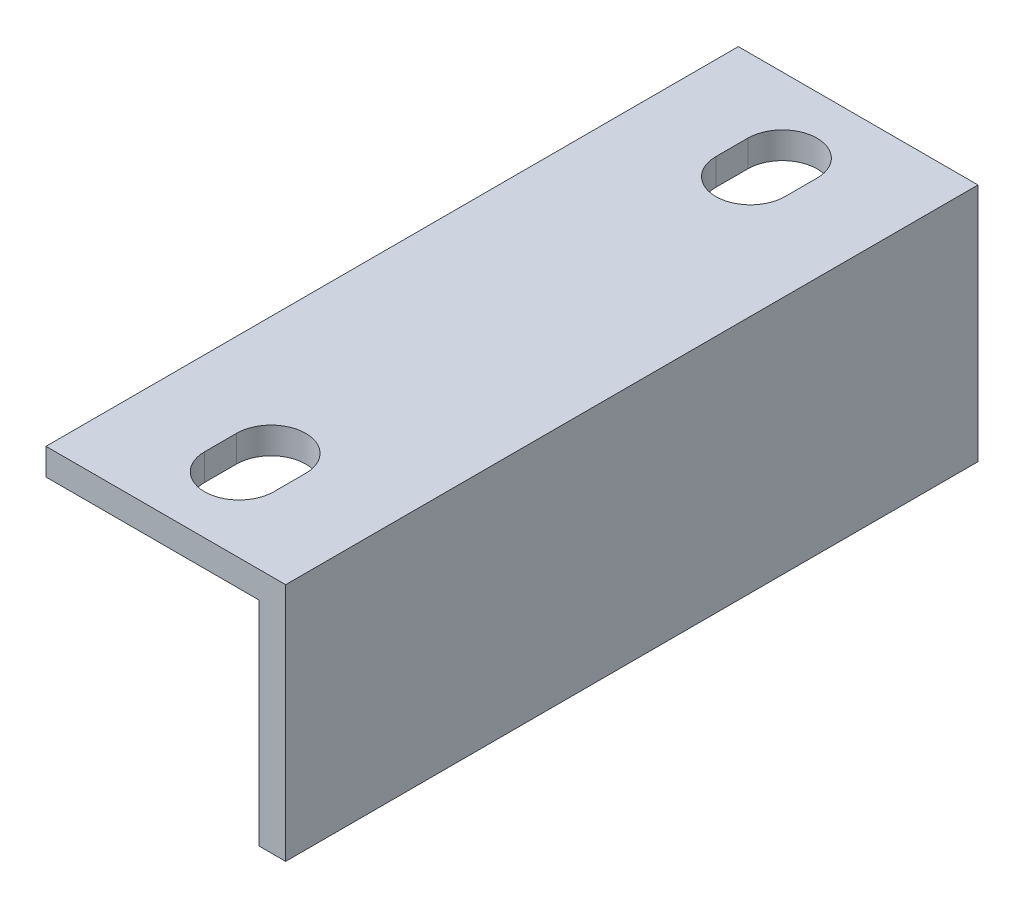
ISO-10303-21;
HEADER;
FILE_DESCRIPTION(('STEP AP214'),'2;1');
FILE_NAME('part.step','',(''),(''),'','','');
FILE_SCHEMA(('AUTOMOTIVE_DESIGN { 1 0 10303 214 1 1 1 1 }'));
ENDSEC;
DATA;
#1=APPLICATION_CONTEXT('core data for automotive mechanical design processes');
#2=APPLICATION_PROTOCOL_DEFINITION('international standard','automotive_design',2000,#1);
#3=PRODUCT_CONTEXT('',#1,'mechanical');
#4=PRODUCT('Part','Part','',(#3));
#5=PRODUCT_RELATED_PRODUCT_CATEGORY('part','',(#4));
#6=PRODUCT_DEFINITION_FORMATION('','',#4);
#7=PRODUCT_DEFINITION_CONTEXT('part definition',#1,'design');
#8=PRODUCT_DEFINITION('design','',#6,#7);
#9=PRODUCT_DEFINITION_SHAPE('','',#8);
#10=(LENGTH_UNIT() NAMED_UNIT(*) SI_UNIT(.MILLI.,.METRE.));
#11=(NAMED_UNIT(*) PLANE_ANGLE_UNIT() SI_UNIT($,.RADIAN.));
#12=(NAMED_UNIT(*) SI_UNIT($,.STERADIAN.) SOLID_ANGLE_UNIT());
#13=UNCERTAINTY_MEASURE_WITH_UNIT(LENGTH_MEASURE(1.E-05),#10,'distance_accuracy_value','');
#14=(GEOMETRIC_REPRESENTATION_CONTEXT(3) GLOBAL_UNCERTAINTY_ASSIGNED_CONTEXT((#13)) GLOBAL_UNIT_ASSIGNED_CONTEXT((#10,
#11,#12)) REPRESENTATION_CONTEXT('',''));
#15=CARTESIAN_POINT('',(0.,0.,0.));
#16=DIRECTION('',(0.,0.,1.));
#17=DIRECTION('',(1.,0.,0.));
#18=AXIS2_PLACEMENT_3D('',#15,#16,#17);
#19=CARTESIAN_POINT('',(0.,0.,130.));
#20=DIRECTION('',(1.,0.,0.));
#21=DIRECTION('',(0.,0.,-1.));
#22=AXIS2_PLACEMENT_3D('',#19,#20,#21);
#23=PLANE('',#22);
#24=DIRECTION('',(0.,-1.,0.));
#25=VECTOR('',#24,1.);
#26=CARTESIAN_POINT('',(0.,0.,0.));
#27=LINE('',#26,#25);
#28=CARTESIAN_POINT('',(0.,5.,0.));
#29=VERTEX_POINT('',#28);
#30=CARTESIAN_POINT('',(0.,0.,0.));
#31=VERTEX_POINT('',#30);
#32=EDGE_CURVE('E239',#29,#31,#27,.T.);
#33=ORIENTED_EDGE('',*,*,#32,.T.);
#34=DIRECTION('',(0.,0.,-1.));
#35=VECTOR('',#34,1.);
#36=CARTESIAN_POINT('',(0.,0.,130.));
#37=LINE('',#36,#35);
#38=CARTESIAN_POINT('',(0.,0.,130.));
#39=VERTEX_POINT('',#38);
#40=EDGE_CURVE('E11',#39,#31,#37,.T.);
#41=ORIENTED_EDGE('',*,*,#40,.F.);
#42=DIRECTION('',(0.,-1.,0.));
#43=VECTOR('',#42,1.);
#44=CARTESIAN_POINT('',(0.,0.,130.));
#45=LINE('',#44,#43);
#46=CARTESIAN_POINT('',(0.,5.,130.));
#47=VERTEX_POINT('',#46);
#48=EDGE_CURVE('E240',#47,#39,#45,.T.);
#49=ORIENTED_EDGE('',*,*,#48,.F.);
#50=DIRECTION('',(0.,0.,-1.));
#51=VECTOR('',#50,1.);
#52=CARTESIAN_POINT('',(0.,5.,130.));
#53=LINE('',#52,#51);
#54=EDGE_CURVE('E260',#47,#29,#53,.T.);
#55=ORIENTED_EDGE('',*,*,#54,.T.);
#56=EDGE_LOOP('',(#33,#41,#49,#55));
#57=FACE_BOUND('',#56,.T.);
#58=ADVANCED_FACE('F45',(#57),#23,.F.);
#59=CARTESIAN_POINT('',(0.,0.,130.));
#60=DIRECTION('',(0.,1.,0.));
#61=DIRECTION('',(0.,0.,1.));
#62=AXIS2_PLACEMENT_3D('',#59,#60,#61);
#63=PLANE('',#62);
#64=DIRECTION('',(0.,0.,-1.));
#65=VECTOR('',#64,1.);
#66=CARTESIAN_POINT('',(28.7730827990603,0.,130.));
#67=LINE('',#66,#65);
#68=CARTESIAN_POINT('',(28.7730827990603,0.,20.));
#69=VERTEX_POINT('',#68);
#70=CARTESIAN_POINT('',(28.7730827990603,0.,14.));
#71=VERTEX_POINT('',#70);
#72=EDGE_CURVE('E231',#69,#71,#67,.T.);
#73=ORIENTED_EDGE('',*,*,#72,.T.);
#74=CARTESIAN_POINT('',(22.2730827990603,0.,14.));
#75=DIRECTION('',(0.,1.,0.));
#76=DIRECTION('',(0.,0.,1.));
#77=AXIS2_PLACEMENT_3D('',#74,#75,#76);
#78=CIRCLE('',#77,6.49999999999998);
#79=CARTESIAN_POINT('',(15.7730827990603,0.,14.));
#80=VERTEX_POINT('',#79);
#81=EDGE_CURVE('E235',#71,#80,#78,.T.);
#82=ORIENTED_EDGE('',*,*,#81,.T.);
#83=DIRECTION('',(0.,0.,1.));
#84=VECTOR('',#83,1.);
#85=CARTESIAN_POINT('',(15.7730827990603,0.,130.));
#86=LINE('',#85,#84);
#87=CARTESIAN_POINT('',(15.7730827990603,0.,20.));
#88=VERTEX_POINT('',#87);
#89=EDGE_CURVE('E226',#80,#88,#86,.T.);
#90=ORIENTED_EDGE('',*,*,#89,.T.);
#91=CARTESIAN_POINT('',(22.2730827990603,0.,20.));
#92=DIRECTION('',(0.,1.,0.));
#93=DIRECTION('',(0.,0.,1.));
#94=AXIS2_PLACEMENT_3D('',#91,#92,#93);
#95=CIRCLE('',#94,6.49999999999998);
#96=EDGE_CURVE('E151',#88,#69,#95,.T.);
#97=ORIENTED_EDGE('',*,*,#96,.T.);
#98=EDGE_LOOP('',(#73,#82,#90,#97));
#99=FACE_BOUND('',#98,.T.);
#100=DIRECTION('',(0.,0.,1.));
#101=VECTOR('',#100,1.);
#102=CARTESIAN_POINT('',(15.7730827990603,0.,130.));
#103=LINE('',#102,#101);
#104=CARTESIAN_POINT('',(15.7730827990603,0.,110.));
#105=VERTEX_POINT('',#104);
#106=CARTESIAN_POINT('',(15.7730827990603,0.,116.));
#107=VERTEX_POINT('',#106);
#108=EDGE_CURVE('E218',#105,#107,#103,.T.);
#109=ORIENTED_EDGE('',*,*,#108,.T.);
#110=CARTESIAN_POINT('',(22.2730827990603,0.,116.));
#111=DIRECTION('',(0.,1.,0.));
#112=DIRECTION('',(0.,0.,1.));
#113=AXIS2_PLACEMENT_3D('',#110,#111,#112);
#114=CIRCLE('',#113,6.49999999999998);
#115=CARTESIAN_POINT('',(28.7730827990603,0.,116.));
#116=VERTEX_POINT('',#115);
#117=EDGE_CURVE('E222',#107,#116,#114,.T.);
#118=ORIENTED_EDGE('',*,*,#117,.T.);
#119=DIRECTION('',(0.,0.,-1.));
#120=VECTOR('',#119,1.);
#121=CARTESIAN_POINT('',(28.7730827990603,0.,130.));
#122=LINE('',#121,#120);
#123=CARTESIAN_POINT('',(28.7730827990603,0.,110.));
#124=VERTEX_POINT('',#123);
#125=EDGE_CURVE('E180',#116,#124,#122,.T.);
#126=ORIENTED_EDGE('',*,*,#125,.T.);
#127=CARTESIAN_POINT('',(22.2730827990603,0.,110.));
#128=DIRECTION('',(0.,1.,0.));
#129=DIRECTION('',(0.,0.,1.));
#130=AXIS2_PLACEMENT_3D('',#127,#128,#129);
#131=CIRCLE('',#130,6.49999999999998);
#132=EDGE_CURVE('E214',#124,#105,#131,.T.);
#133=ORIENTED_EDGE('',*,*,#132,.T.);
#134=EDGE_LOOP('',(#109,#118,#126,#133));
#135=FACE_BOUND('',#134,.T.);
#136=DIRECTION('',(1.,0.,0.));
#137=VECTOR('',#136,1.);
#138=CARTESIAN_POINT('',(0.,0.,0.));
#139=LINE('',#138,#137);
#140=CARTESIAN_POINT('',(40.,0.,0.));
#141=VERTEX_POINT('',#140);
#142=EDGE_CURVE('E264',#31,#141,#139,.T.);
#143=ORIENTED_EDGE('',*,*,#142,.T.);
#144=DIRECTION('',(0.,0.,-1.));
#145=VECTOR('',#144,1.);
#146=CARTESIAN_POINT('',(40.,0.,130.));
#147=LINE('',#146,#145);
#148=CARTESIAN_POINT('',(40.,0.,130.));
#149=VERTEX_POINT('',#148);
#150=EDGE_CURVE('E53',#149,#141,#147,.T.);
#151=ORIENTED_EDGE('',*,*,#150,.F.);
#152=DIRECTION('',(1.,0.,0.));
#153=VECTOR('',#152,1.);
#154=CARTESIAN_POINT('',(0.,0.,130.));
#155=LINE('',#154,#153);
#156=EDGE_CURVE('E244',#39,#149,#155,.T.);
#157=ORIENTED_EDGE('',*,*,#156,.F.);
#158=ORIENTED_EDGE('',*,*,#40,.T.);
#159=EDGE_LOOP('',(#143,#151,#157,#158));
#160=FACE_BOUND('',#159,.T.);
#161=ADVANCED_FACE('F321',(#99,#135,#160),#63,.F.);
#162=CARTESIAN_POINT('',(40.,0.,130.));
#163=DIRECTION('',(1.,0.,0.));
#164=DIRECTION('',(0.,0.,-1.));
#165=AXIS2_PLACEMENT_3D('',#162,#163,#164);
#166=PLANE('',#165);
#167=DIRECTION('',(0.,-1.,0.));
#168=VECTOR('',#167,1.);
#169=CARTESIAN_POINT('',(40.,0.,0.));
#170=LINE('',#169,#168);
#171=CARTESIAN_POINT('',(40.,-40.,0.));
#172=VERTEX_POINT('',#171);
#173=EDGE_CURVE('E267',#141,#172,#170,.T.);
#174=ORIENTED_EDGE('',*,*,#173,.T.);
#175=DIRECTION('',(0.,0.,-1.));
#176=VECTOR('',#175,1.);
#177=CARTESIAN_POINT('',(40.,-40.,130.));
#178=LINE('',#177,#176);
#179=CARTESIAN_POINT('',(40.,-40.,130.));
#180=VERTEX_POINT('',#179);
#181=EDGE_CURVE('E289',#180,#172,#178,.T.);
#182=ORIENTED_EDGE('',*,*,#181,.F.);
#183=DIRECTION('',(0.,-1.,0.));
#184=VECTOR('',#183,1.);
#185=CARTESIAN_POINT('',(40.,0.,130.));
#186=LINE('',#185,#184);
#187=EDGE_CURVE('E248',#149,#180,#186,.T.);
#188=ORIENTED_EDGE('',*,*,#187,.F.);
#189=ORIENTED_EDGE('',*,*,#150,.T.);
#190=EDGE_LOOP('',(#174,#182,#188,#189));
#191=FACE_BOUND('',#190,.T.);
#192=ADVANCED_FACE('F298',(#191),#166,.F.);
#193=CARTESIAN_POINT('',(40.,-40.,130.));
#194=DIRECTION('',(0.,1.,0.));
#195=DIRECTION('',(0.,0.,1.));
#196=AXIS2_PLACEMENT_3D('',#193,#194,#195);
#197=PLANE('',#196);
#198=DIRECTION('',(1.,0.,0.));
#199=VECTOR('',#198,1.);
#200=CARTESIAN_POINT('',(40.,-40.,0.));
#201=LINE('',#200,#199);
#202=CARTESIAN_POINT('',(45.,-40.,0.));
#203=VERTEX_POINT('',#202);
#204=EDGE_CURVE('E270',#172,#203,#201,.T.);
#205=ORIENTED_EDGE('',*,*,#204,.T.);
#206=DIRECTION('',(0.,0.,-1.));
#207=VECTOR('',#206,1.);
#208=CARTESIAN_POINT('',(45.,-40.,130.));
#209=LINE('',#208,#207);
#210=CARTESIAN_POINT('',(45.,-40.,130.));
#211=VERTEX_POINT('',#210);
#212=EDGE_CURVE('E285',#211,#203,#209,.T.);
#213=ORIENTED_EDGE('',*,*,#212,.F.);
#214=DIRECTION('',(1.,0.,0.));
#215=VECTOR('',#214,1.);
#216=CARTESIAN_POINT('',(40.,-40.,130.));
#217=LINE('',#216,#215);
#218=EDGE_CURVE('E251',#180,#211,#217,.T.);
#219=ORIENTED_EDGE('',*,*,#218,.F.);
#220=ORIENTED_EDGE('',*,*,#181,.T.);
#221=EDGE_LOOP('',(#205,#213,#219,#220));
#222=FACE_BOUND('',#221,.T.);
#223=ADVANCED_FACE('F309',(#222),#197,.F.);
#224=CARTESIAN_POINT('',(45.,5.,130.));
#225=DIRECTION('',(-1.,0.,0.));
#226=DIRECTION('',(0.,-1.,0.));
#227=AXIS2_PLACEMENT_3D('',#224,#225,#226);
#228=PLANE('',#227);
#229=DIRECTION('',(0.,1.,0.));
#230=VECTOR('',#229,1.);
#231=CARTESIAN_POINT('',(45.,5.,0.));
#232=LINE('',#231,#230);
#233=CARTESIAN_POINT('',(45.,5.,0.));
#234=VERTEX_POINT('',#233);
#235=EDGE_CURVE('E273',#203,#234,#232,.T.);
#236=ORIENTED_EDGE('',*,*,#235,.T.);
#237=DIRECTION('',(0.,0.,-1.));
#238=VECTOR('',#237,1.);
#239=CARTESIAN_POINT('',(45.,5.,130.));
#240=LINE('',#239,#238);
#241=CARTESIAN_POINT('',(45.,5.,130.));
#242=VERTEX_POINT('',#241);
#243=EDGE_CURVE('E281',#242,#234,#240,.T.);
#244=ORIENTED_EDGE('',*,*,#243,.F.);
#245=DIRECTION('',(0.,1.,0.));
#246=VECTOR('',#245,1.);
#247=CARTESIAN_POINT('',(45.,5.,130.));
#248=LINE('',#247,#246);
#249=EDGE_CURVE('E254',#211,#242,#248,.T.);
#250=ORIENTED_EDGE('',*,*,#249,.F.);
#251=ORIENTED_EDGE('',*,*,#212,.T.);
#252=EDGE_LOOP('',(#236,#244,#250,#251));
#253=FACE_BOUND('',#252,.T.);
#254=ADVANCED_FACE('F313',(#253),#228,.F.);
#255=CARTESIAN_POINT('',(0.,5.,130.));
#256=DIRECTION('',(0.,-1.,0.));
#257=DIRECTION('',(0.,0.,-1.));
#258=AXIS2_PLACEMENT_3D('',#255,#256,#257);
#259=PLANE('',#258);
#260=DIRECTION('',(0.,0.,1.));
#261=VECTOR('',#260,1.);
#262=CARTESIAN_POINT('',(15.7730827990603,5.,14.));
#263=LINE('',#262,#261);
#264=CARTESIAN_POINT('',(15.7730827990603,5.,14.));
#265=VERTEX_POINT('',#264);
#266=CARTESIAN_POINT('',(15.7730827990603,5.,20.));
#267=VERTEX_POINT('',#266);
#268=EDGE_CURVE('E159',#265,#267,#263,.T.);
#269=ORIENTED_EDGE('',*,*,#268,.F.);
#270=CARTESIAN_POINT('',(22.2730827990603,5.,14.));
#271=DIRECTION('',(0.,1.,0.));
#272=DIRECTION('',(0.,0.,1.));
#273=AXIS2_PLACEMENT_3D('',#270,#271,#272);
#274=CIRCLE('',#273,6.49999999999998);
#275=CARTESIAN_POINT('',(28.7730827990603,5.,14.));
#276=VERTEX_POINT('',#275);
#277=EDGE_CURVE('E165',#276,#265,#274,.T.);
#278=ORIENTED_EDGE('',*,*,#277,.F.);
#279=DIRECTION('',(0.,0.,-1.));
#280=VECTOR('',#279,1.);
#281=CARTESIAN_POINT('',(28.7730827990603,5.,14.));
#282=LINE('',#281,#280);
#283=CARTESIAN_POINT('',(28.7730827990603,5.,20.));
#284=VERTEX_POINT('',#283);
#285=EDGE_CURVE('E170',#284,#276,#282,.T.);
#286=ORIENTED_EDGE('',*,*,#285,.F.);
#287=CARTESIAN_POINT('',(22.2730827990603,5.,20.));
#288=DIRECTION('',(0.,1.,0.));
#289=DIRECTION('',(0.,0.,1.));
#290=AXIS2_PLACEMENT_3D('',#287,#288,#289);
#291=CIRCLE('',#290,6.49999999999998);
#292=EDGE_CURVE('E148',#267,#284,#291,.T.);
#293=ORIENTED_EDGE('',*,*,#292,.F.);
#294=EDGE_LOOP('',(#269,#278,#286,#293));
#295=FACE_BOUND('',#294,.T.);
#296=DIRECTION('',(0.,0.,-1.));
#297=VECTOR('',#296,1.);
#298=CARTESIAN_POINT('',(28.7730827990603,5.,116.));
#299=LINE('',#298,#297);
#300=CARTESIAN_POINT('',(28.7730827990603,5.,116.));
#301=VERTEX_POINT('',#300);
#302=CARTESIAN_POINT('',(28.7730827990603,5.,110.));
#303=VERTEX_POINT('',#302);
#304=EDGE_CURVE('E205',#301,#303,#299,.T.);
#305=ORIENTED_EDGE('',*,*,#304,.F.);
#306=CARTESIAN_POINT('',(22.2730827990603,5.,116.));
#307=DIRECTION('',(0.,1.,0.));
#308=DIRECTION('',(0.,0.,-1.));
#309=AXIS2_PLACEMENT_3D('',#306,#307,#308);
#310=CIRCLE('',#309,6.49999999999998);
#311=CARTESIAN_POINT('',(15.7730827990603,5.,116.));
#312=VERTEX_POINT('',#311);
#313=EDGE_CURVE('E208',#312,#301,#310,.T.);
#314=ORIENTED_EDGE('',*,*,#313,.F.);
#315=DIRECTION('',(0.,0.,1.));
#316=VECTOR('',#315,1.);
#317=CARTESIAN_POINT('',(15.7730827990603,5.,116.));
#318=LINE('',#317,#316);
#319=CARTESIAN_POINT('',(15.7730827990603,5.,110.));
#320=VERTEX_POINT('',#319);
#321=EDGE_CURVE('E189',#320,#312,#318,.T.);
#322=ORIENTED_EDGE('',*,*,#321,.F.);
#323=CARTESIAN_POINT('',(22.2730827990603,5.,110.));
#324=DIRECTION('',(0.,1.,0.));
#325=DIRECTION('',(0.,0.,-1.));
#326=AXIS2_PLACEMENT_3D('',#323,#324,#325);
#327=CIRCLE('',#326,6.49999999999998);
#328=EDGE_CURVE('E201',#303,#320,#327,.T.);
#329=ORIENTED_EDGE('',*,*,#328,.F.);
#330=EDGE_LOOP('',(#305,#314,#322,#329));
#331=FACE_BOUND('',#330,.T.);
#332=DIRECTION('',(-1.,0.,0.));
#333=VECTOR('',#332,1.);
#334=CARTESIAN_POINT('',(0.,5.,0.));
#335=LINE('',#334,#333);
#336=EDGE_CURVE('E245',#234,#29,#335,.T.);
#337=ORIENTED_EDGE('',*,*,#336,.T.);
#338=ORIENTED_EDGE('',*,*,#54,.F.);
#339=DIRECTION('',(-1.,0.,0.));
#340=VECTOR('',#339,1.);
#341=CARTESIAN_POINT('',(0.,5.,130.));
#342=LINE('',#341,#340);
#343=EDGE_CURVE('E257',#242,#47,#342,.T.);
#344=ORIENTED_EDGE('',*,*,#343,.F.);
#345=ORIENTED_EDGE('',*,*,#243,.T.);
#346=EDGE_LOOP('',(#337,#338,#344,#345));
#347=FACE_BOUND('',#346,.T.);
#348=ADVANCED_FACE('F167',(#295,#331,#347),#259,.F.);
#349=CARTESIAN_POINT('',(0.,0.,130.));
#350=DIRECTION('',(0.,0.,-1.));
#351=DIRECTION('',(-1.,0.,0.));
#352=AXIS2_PLACEMENT_3D('',#349,#350,#351);
#353=PLANE('',#352);
#354=ORIENTED_EDGE('',*,*,#48,.T.);
#355=ORIENTED_EDGE('',*,*,#156,.T.);
#356=ORIENTED_EDGE('',*,*,#187,.T.);
#357=ORIENTED_EDGE('',*,*,#218,.T.);
#358=ORIENTED_EDGE('',*,*,#249,.T.);
#359=ORIENTED_EDGE('',*,*,#343,.T.);
#360=EDGE_LOOP('',(#354,#355,#356,#357,#358,#359));
#361=FACE_BOUND('',#360,.T.);
#362=ADVANCED_FACE('F317',(#361),#353,.F.);
#363=CARTESIAN_POINT('',(0.,0.,0.));
#364=DIRECTION('',(0.,0.,-1.));
#365=DIRECTION('',(-1.,0.,0.));
#366=AXIS2_PLACEMENT_3D('',#363,#364,#365);
#367=PLANE('',#366);
#368=ORIENTED_EDGE('',*,*,#32,.F.);
#369=ORIENTED_EDGE('',*,*,#336,.F.);
#370=ORIENTED_EDGE('',*,*,#235,.F.);
#371=ORIENTED_EDGE('',*,*,#204,.F.);
#372=ORIENTED_EDGE('',*,*,#173,.F.);
#373=ORIENTED_EDGE('',*,*,#142,.F.);
#374=EDGE_LOOP('',(#368,#369,#370,#371,#372,#373));
#375=FACE_BOUND('',#374,.T.);
#376=ADVANCED_FACE('F304',(#375),#367,.T.);
#377=CARTESIAN_POINT('',(22.2730827990603,-5.,116.));
#378=DIRECTION('',(0.,1.,0.));
#379=DIRECTION('',(0.,0.,1.));
#380=AXIS2_PLACEMENT_3D('',#377,#378,#379);
#381=CYLINDRICAL_SURFACE('',#380,6.49999999999998);
#382=DIRECTION('',(0.,1.,0.));
#383=VECTOR('',#382,1.);
#384=CARTESIAN_POINT('',(15.7730827990603,-5.,116.));
#385=LINE('',#384,#383);
#386=EDGE_CURVE('E195',#107,#312,#385,.T.);
#387=ORIENTED_EDGE('',*,*,#386,.T.);
#388=ORIENTED_EDGE('',*,*,#313,.T.);
#389=DIRECTION('',(0.,1.,0.));
#390=VECTOR('',#389,1.);
#391=CARTESIAN_POINT('',(28.7730827990603,-5.,116.));
#392=LINE('',#391,#390);
#393=EDGE_CURVE('E185',#116,#301,#392,.T.);
#394=ORIENTED_EDGE('',*,*,#393,.F.);
#395=ORIENTED_EDGE('',*,*,#117,.F.);
#396=EDGE_LOOP('',(#387,#388,#394,#395));
#397=FACE_BOUND('',#396,.T.);
#398=ADVANCED_FACE('F366',(#397),#381,.F.);
#399=CARTESIAN_POINT('',(15.7730827990603,-5.,116.));
#400=DIRECTION('',(-1.,0.,0.));
#401=DIRECTION('',(0.,0.,1.));
#402=AXIS2_PLACEMENT_3D('',#399,#400,#401);
#403=PLANE('',#402);
#404=DIRECTION('',(0.,1.,0.));
#405=VECTOR('',#404,1.);
#406=CARTESIAN_POINT('',(15.7730827990603,-5.,110.));
#407=LINE('',#406,#405);
#408=EDGE_CURVE('E192',#105,#320,#407,.T.);
#409=ORIENTED_EDGE('',*,*,#408,.T.);
#410=ORIENTED_EDGE('',*,*,#321,.T.);
#411=ORIENTED_EDGE('',*,*,#386,.F.);
#412=ORIENTED_EDGE('',*,*,#108,.F.);
#413=EDGE_LOOP('',(#409,#410,#411,#412));
#414=FACE_BOUND('',#413,.T.);
#415=ADVANCED_FACE('F376',(#414),#403,.F.);
#416=CARTESIAN_POINT('',(22.2730827990603,-5.,110.));
#417=DIRECTION('',(0.,1.,0.));
#418=DIRECTION('',(0.,0.,1.));
#419=AXIS2_PLACEMENT_3D('',#416,#417,#418);
#420=CYLINDRICAL_SURFACE('',#419,6.49999999999998);
#421=DIRECTION('',(0.,1.,0.));
#422=VECTOR('',#421,1.);
#423=CARTESIAN_POINT('',(28.7730827990603,-5.,110.));
#424=LINE('',#423,#422);
#425=EDGE_CURVE('E68',#124,#303,#424,.T.);
#426=ORIENTED_EDGE('',*,*,#425,.T.);
#427=ORIENTED_EDGE('',*,*,#328,.T.);
#428=ORIENTED_EDGE('',*,*,#408,.F.);
#429=ORIENTED_EDGE('',*,*,#132,.F.);
#430=EDGE_LOOP('',(#426,#427,#428,#429));
#431=FACE_BOUND('',#430,.T.);
#432=ADVANCED_FACE('F386',(#431),#420,.F.);
#433=CARTESIAN_POINT('',(28.7730827990603,-5.,116.));
#434=DIRECTION('',(1.,0.,0.));
#435=DIRECTION('',(0.,0.,-1.));
#436=AXIS2_PLACEMENT_3D('',#433,#434,#435);
#437=PLANE('',#436);
#438=ORIENTED_EDGE('',*,*,#393,.T.);
#439=ORIENTED_EDGE('',*,*,#304,.T.);
#440=ORIENTED_EDGE('',*,*,#425,.F.);
#441=ORIENTED_EDGE('',*,*,#125,.F.);
#442=EDGE_LOOP('',(#438,#439,#440,#441));
#443=FACE_BOUND('',#442,.T.);
#444=ADVANCED_FACE('F396',(#443),#437,.F.);
#445=CARTESIAN_POINT('',(22.2730827990603,-5.,14.));
#446=DIRECTION('',(0.,1.,0.));
#447=DIRECTION('',(0.,0.,1.));
#448=AXIS2_PLACEMENT_3D('',#445,#446,#447);
#449=CYLINDRICAL_SURFACE('',#448,6.49999999999998);
#450=DIRECTION('',(0.,1.,0.));
#451=VECTOR('',#450,1.);
#452=CARTESIAN_POINT('',(28.7730827990603,-5.,14.));
#453=LINE('',#452,#451);
#454=EDGE_CURVE('E177',#71,#276,#453,.T.);
#455=ORIENTED_EDGE('',*,*,#454,.T.);
#456=ORIENTED_EDGE('',*,*,#277,.T.);
#457=DIRECTION('',(0.,1.,0.));
#458=VECTOR('',#457,1.);
#459=CARTESIAN_POINT('',(15.7730827990603,-5.,14.));
#460=LINE('',#459,#458);
#461=EDGE_CURVE('E155',#80,#265,#460,.T.);
#462=ORIENTED_EDGE('',*,*,#461,.F.);
#463=ORIENTED_EDGE('',*,*,#81,.F.);
#464=EDGE_LOOP('',(#455,#456,#462,#463));
#465=FACE_BOUND('',#464,.T.);
#466=ADVANCED_FACE('F406',(#465),#449,.F.);
#467=CARTESIAN_POINT('',(28.7730827990603,-5.,14.));
#468=DIRECTION('',(1.,0.,0.));
#469=DIRECTION('',(0.,0.,-1.));
#470=AXIS2_PLACEMENT_3D('',#467,#468,#469);
#471=PLANE('',#470);
#472=DIRECTION('',(0.,1.,0.));
#473=VECTOR('',#472,1.);
#474=CARTESIAN_POINT('',(28.7730827990603,-5.,20.));
#475=LINE('',#474,#473);
#476=EDGE_CURVE('E154',#69,#284,#475,.T.);
#477=ORIENTED_EDGE('',*,*,#476,.T.);
#478=ORIENTED_EDGE('',*,*,#285,.T.);
#479=ORIENTED_EDGE('',*,*,#454,.F.);
#480=ORIENTED_EDGE('',*,*,#72,.F.);
#481=EDGE_LOOP('',(#477,#478,#479,#480));
#482=FACE_BOUND('',#481,.T.);
#483=ADVANCED_FACE('F415',(#482),#471,.F.);
#484=CARTESIAN_POINT('',(22.2730827990603,-5.,20.));
#485=DIRECTION('',(0.,1.,0.));
#486=DIRECTION('',(0.,0.,1.));
#487=AXIS2_PLACEMENT_3D('',#484,#485,#486);
#488=CYLINDRICAL_SURFACE('',#487,6.49999999999998);
#489=DIRECTION('',(0.,1.,0.));
#490=VECTOR('',#489,1.);
#491=CARTESIAN_POINT('',(15.7730827990603,-5.,20.));
#492=LINE('',#491,#490);
#493=EDGE_CURVE('E60',#88,#267,#492,.T.);
#494=ORIENTED_EDGE('',*,*,#493,.T.);
#495=ORIENTED_EDGE('',*,*,#292,.T.);
#496=ORIENTED_EDGE('',*,*,#476,.F.);
#497=ORIENTED_EDGE('',*,*,#96,.F.);
#498=EDGE_LOOP('',(#494,#495,#496,#497));
#499=FACE_BOUND('',#498,.T.);
#500=ADVANCED_FACE('F145',(#499),#488,.F.);
#501=CARTESIAN_POINT('',(15.7730827990603,-5.,14.));
#502=DIRECTION('',(-1.,0.,0.));
#503=DIRECTION('',(0.,0.,1.));
#504=AXIS2_PLACEMENT_3D('',#501,#502,#503);
#505=PLANE('',#504);
#506=ORIENTED_EDGE('',*,*,#461,.T.);
#507=ORIENTED_EDGE('',*,*,#268,.T.);
#508=ORIENTED_EDGE('',*,*,#493,.F.);
#509=ORIENTED_EDGE('',*,*,#89,.F.);
#510=EDGE_LOOP('',(#506,#507,#508,#509));
#511=FACE_BOUND('',#510,.T.);
#512=ADVANCED_FACE('F160',(#511),#505,.F.);
#513=CLOSED_SHELL('',(#58,#161,#192,#223,#254,#348,#362,#376,#398,#415,#432,#444,#466,#483,#500,#512));
#514=MANIFOLD_SOLID_BREP('B2',#513);
#515=ADVANCED_BREP_SHAPE_REPRESENTATION('',(#18,#514),#14);
#516=SHAPE_DEFINITION_REPRESENTATION(#9,#515);
ENDSEC;
END-ISO-10303-21;
